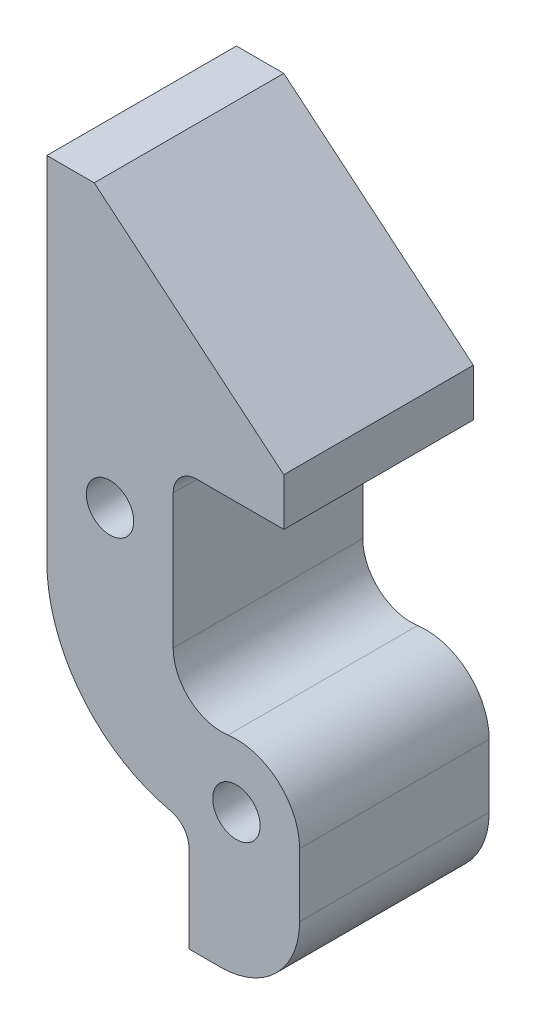
ISO-10303-21;
HEADER;
FILE_DESCRIPTION(('STEP AP214'),'2;1');
FILE_NAME('part.step','',(''),(''),'','','');
FILE_SCHEMA(('AUTOMOTIVE_DESIGN { 1 0 10303 214 1 1 1 1 }'));
ENDSEC;
DATA;
#1=APPLICATION_CONTEXT('core data for automotive mechanical design processes');
#2=APPLICATION_PROTOCOL_DEFINITION('international standard','automotive_design',2000,#1);
#3=PRODUCT_CONTEXT('',#1,'mechanical');
#4=PRODUCT('Part','Part','',(#3));
#5=PRODUCT_RELATED_PRODUCT_CATEGORY('part','',(#4));
#6=PRODUCT_DEFINITION_FORMATION('','',#4);
#7=PRODUCT_DEFINITION_CONTEXT('part definition',#1,'design');
#8=PRODUCT_DEFINITION('design','',#6,#7);
#9=PRODUCT_DEFINITION_SHAPE('','',#8);
#10=(LENGTH_UNIT() NAMED_UNIT(*) SI_UNIT(.MILLI.,.METRE.));
#11=(NAMED_UNIT(*) PLANE_ANGLE_UNIT() SI_UNIT($,.RADIAN.));
#12=(NAMED_UNIT(*) SI_UNIT($,.STERADIAN.) SOLID_ANGLE_UNIT());
#13=UNCERTAINTY_MEASURE_WITH_UNIT(LENGTH_MEASURE(1.E-05),#10,'distance_accuracy_value','');
#14=(GEOMETRIC_REPRESENTATION_CONTEXT(3) GLOBAL_UNCERTAINTY_ASSIGNED_CONTEXT((#13)) GLOBAL_UNIT_ASSIGNED_CONTEXT((#10,
#11,#12)) REPRESENTATION_CONTEXT('',''));
#15=CARTESIAN_POINT('',(0.,0.,0.));
#16=DIRECTION('',(0.,0.,1.));
#17=DIRECTION('',(1.,0.,0.));
#18=AXIS2_PLACEMENT_3D('',#15,#16,#17);
#19=CARTESIAN_POINT('',(-0.937500000000002,7.,12.));
#20=DIRECTION('',(0.,0.,1.));
#21=DIRECTION('',(1.,0.,0.));
#22=AXIS2_PLACEMENT_3D('',#19,#20,#21);
#23=PLANE('',#22);
#24=CARTESIAN_POINT('',(-4.5,-3.47318003282671,12.));
#25=DIRECTION('',(0.,0.,-1.));
#26=DIRECTION('',(-1.,0.,0.));
#27=AXIS2_PLACEMENT_3D('',#24,#25,#26);
#28=CIRCLE('',#27,1.5);
#29=CARTESIAN_POINT('',(-4.17391304347826,-2.00905322930647,12.));
#30=VERTEX_POINT('',#29);
#31=CARTESIAN_POINT('',(-3.00023737244657,-3.49986450385469,12.));
#32=VERTEX_POINT('',#31);
#33=EDGE_CURVE('E179',#30,#32,#28,.T.);
#34=ORIENTED_EDGE('',*,*,#33,.T.);
#35=CARTESIAN_POINT('',(6.99818014457627,-3.67776097737457,12.));
#36=DIRECTION('',(0.,0.,1.));
#37=DIRECTION('',(1.,0.,0.));
#38=AXIS2_PLACEMENT_3D('',#35,#36,#37);
#39=CIRCLE('',#38,10.);
#40=CARTESIAN_POINT('',(-3.,-3.86853255964208,12.));
#41=VERTEX_POINT('',#40);
#42=EDGE_CURVE('E13',#32,#41,#39,.T.);
#43=ORIENTED_EDGE('',*,*,#42,.T.);
#44=DIRECTION('',(0.,1.,0.));
#45=VECTOR('',#44,1.);
#46=CARTESIAN_POINT('',(-3.,-9.00000000000002,12.));
#47=LINE('',#46,#45);
#48=CARTESIAN_POINT('',(-3.,-9.00000000000002,12.));
#49=VERTEX_POINT('',#48);
#50=EDGE_CURVE('E184',#49,#41,#47,.T.);
#51=ORIENTED_EDGE('',*,*,#50,.F.);
#52=DIRECTION('',(-1.,0.,0.));
#53=VECTOR('',#52,1.);
#54=CARTESIAN_POINT('',(4.,-9.00000000000002,12.));
#55=LINE('',#54,#53);
#56=CARTESIAN_POINT('',(-0.999999999999999,-9.00000000000002,12.));
#57=VERTEX_POINT('',#56);
#58=EDGE_CURVE('E183',#57,#49,#55,.T.);
#59=ORIENTED_EDGE('',*,*,#58,.F.);
#60=CARTESIAN_POINT('',(-0.999999999999999,-4.00000000000002,12.));
#61=DIRECTION('',(0.,0.,1.));
#62=DIRECTION('',(1.,0.,0.));
#63=AXIS2_PLACEMENT_3D('',#60,#61,#62);
#64=CIRCLE('',#63,5.);
#65=CARTESIAN_POINT('',(4.,-4.00000000000002,12.));
#66=VERTEX_POINT('',#65);
#67=EDGE_CURVE('E280',#57,#66,#64,.T.);
#68=ORIENTED_EDGE('',*,*,#67,.T.);
#69=DIRECTION('',(0.,-1.,0.));
#70=VECTOR('',#69,1.);
#71=CARTESIAN_POINT('',(4.,0.,12.));
#72=LINE('',#71,#70);
#73=CARTESIAN_POINT('',(4.,0.,12.));
#74=VERTEX_POINT('',#73);
#75=EDGE_CURVE('E167',#74,#66,#72,.T.);
#76=ORIENTED_EDGE('',*,*,#75,.F.);
#77=CARTESIAN_POINT('',(0.,0.,12.));
#78=DIRECTION('',(0.,0.,1.));
#79=DIRECTION('',(1.,0.,0.));
#80=AXIS2_PLACEMENT_3D('',#77,#78,#79);
#81=CIRCLE('',#80,4.);
#82=CARTESIAN_POINT('',(-0.530973451327437,3.96460176991151,12.));
#83=VERTEX_POINT('',#82);
#84=EDGE_CURVE('E218',#74,#83,#81,.T.);
#85=ORIENTED_EDGE('',*,*,#84,.T.);
#86=CARTESIAN_POINT('',(-0.937500000000002,7.,12.));
#87=DIRECTION('',(0.,0.,-1.));
#88=DIRECTION('',(1.,0.,0.));
#89=AXIS2_PLACEMENT_3D('',#86,#87,#88);
#90=CIRCLE('',#89,3.0625);
#91=CARTESIAN_POINT('',(-4.,7.,12.));
#92=VERTEX_POINT('',#91);
#93=EDGE_CURVE('E220',#83,#92,#90,.T.);
#94=ORIENTED_EDGE('',*,*,#93,.T.);
#95=DIRECTION('',(0.,1.,0.));
#96=VECTOR('',#95,1.);
#97=CARTESIAN_POINT('',(-4.,7.,12.));
#98=LINE('',#97,#96);
#99=CARTESIAN_POINT('',(-4.,15.5,12.));
#100=VERTEX_POINT('',#99);
#101=EDGE_CURVE('E222',#92,#100,#98,.T.);
#102=ORIENTED_EDGE('',*,*,#101,.T.);
#103=CARTESIAN_POINT('',(-2.5,15.5,12.));
#104=DIRECTION('',(0.,0.,1.));
#105=DIRECTION('',(1.,0.,0.));
#106=AXIS2_PLACEMENT_3D('',#103,#104,#105);
#107=CIRCLE('',#106,1.5);
#108=CARTESIAN_POINT('',(-2.5,17.,12.));
#109=VERTEX_POINT('',#108);
#110=EDGE_CURVE('E271',#100,#109,#107,.F.);
#111=ORIENTED_EDGE('',*,*,#110,.T.);
#112=DIRECTION('',(1.,0.,0.));
#113=VECTOR('',#112,1.);
#114=CARTESIAN_POINT('',(-4.,17.,12.));
#115=LINE('',#114,#113);
#116=CARTESIAN_POINT('',(3.,17.,12.));
#117=VERTEX_POINT('',#116);
#118=EDGE_CURVE('E225',#109,#117,#115,.T.);
#119=ORIENTED_EDGE('',*,*,#118,.T.);
#120=DIRECTION('',(0.,1.,0.));
#121=VECTOR('',#120,1.);
#122=CARTESIAN_POINT('',(3.,17.,12.));
#123=LINE('',#122,#121);
#124=CARTESIAN_POINT('',(3.,20.,12.));
#125=VERTEX_POINT('',#124);
#126=EDGE_CURVE('E227',#117,#125,#123,.T.);
#127=ORIENTED_EDGE('',*,*,#126,.T.);
#128=DIRECTION('',(-0.768221279597376,0.64018439966448,0.));
#129=VECTOR('',#128,1.);
#130=CARTESIAN_POINT('',(3.,20.,12.));
#131=LINE('',#130,#129);
#132=CARTESIAN_POINT('',(-9.00000000000001,30.,12.));
#133=VERTEX_POINT('',#132);
#134=EDGE_CURVE('E209',#125,#133,#131,.T.);
#135=ORIENTED_EDGE('',*,*,#134,.T.);
#136=DIRECTION('',(-1.,0.,0.));
#137=VECTOR('',#136,1.);
#138=CARTESIAN_POINT('',(-9.00000000000001,30.,12.));
#139=LINE('',#138,#137);
#140=CARTESIAN_POINT('',(-12.,30.,12.));
#141=VERTEX_POINT('',#140);
#142=EDGE_CURVE('E212',#133,#141,#139,.T.);
#143=ORIENTED_EDGE('',*,*,#142,.T.);
#144=DIRECTION('',(0.,-1.,0.));
#145=VECTOR('',#144,1.);
#146=CARTESIAN_POINT('',(-12.,30.,12.));
#147=LINE('',#146,#145);
#148=CARTESIAN_POINT('',(-12.,7.75179212749512,12.));
#149=VERTEX_POINT('',#148);
#150=EDGE_CURVE('E215',#141,#149,#147,.T.);
#151=ORIENTED_EDGE('',*,*,#150,.T.);
#152=CARTESIAN_POINT('',(-2.,7.75179212749512,12.));
#153=DIRECTION('',(0.,0.,1.));
#154=DIRECTION('',(1.,0.,0.));
#155=AXIS2_PLACEMENT_3D('',#152,#153,#154);
#156=CIRCLE('',#155,10.);
#157=EDGE_CURVE('E285',#149,#30,#156,.T.);
#158=ORIENTED_EDGE('',*,*,#157,.T.);
#159=EDGE_LOOP('',(#34,#43,#51,#59,#68,#76,#85,#94,#102,#111,#119,#127,#135,#143,#151,#158));
#160=FACE_BOUND('',#159,.T.);
#161=CARTESIAN_POINT('',(0.,0.,12.));
#162=DIRECTION('',(0.,0.,1.));
#163=DIRECTION('',(1.,0.,0.));
#164=AXIS2_PLACEMENT_3D('',#161,#162,#163);
#165=CIRCLE('',#164,1.5);
#166=CARTESIAN_POINT('',(1.5,0.,12.));
#167=VERTEX_POINT('',#166);
#168=EDGE_CURVE('E203',#167,#167,#165,.T.);
#169=ORIENTED_EDGE('',*,*,#168,.F.);
#170=EDGE_LOOP('',(#169));
#171=FACE_BOUND('',#170,.T.);
#172=CARTESIAN_POINT('',(-8.,12.6885775404495,12.));
#173=DIRECTION('',(0.,0.,1.));
#174=DIRECTION('',(1.,0.,0.));
#175=AXIS2_PLACEMENT_3D('',#172,#173,#174);
#176=CIRCLE('',#175,1.5);
#177=CARTESIAN_POINT('',(-6.5,12.6885775404495,12.));
#178=VERTEX_POINT('',#177);
#179=EDGE_CURVE('E197',#178,#178,#176,.T.);
#180=ORIENTED_EDGE('',*,*,#179,.F.);
#181=EDGE_LOOP('',(#180));
#182=FACE_BOUND('',#181,.T.);
#183=ADVANCED_FACE('F46',(#160,#171,#182),#23,.T.);
#184=CARTESIAN_POINT('',(-0.937500000000002,7.,0.));
#185=DIRECTION('',(0.,0.,1.));
#186=DIRECTION('',(1.,0.,0.));
#187=AXIS2_PLACEMENT_3D('',#184,#185,#186);
#188=PLANE('',#187);
#189=DIRECTION('',(0.,-1.,0.));
#190=VECTOR('',#189,1.);
#191=CARTESIAN_POINT('',(-3.,-9.00000000000002,0.));
#192=LINE('',#191,#190);
#193=CARTESIAN_POINT('',(-3.,-3.86853255964208,0.));
#194=VERTEX_POINT('',#193);
#195=CARTESIAN_POINT('',(-3.,-9.00000000000002,0.));
#196=VERTEX_POINT('',#195);
#197=EDGE_CURVE('E161',#194,#196,#192,.T.);
#198=ORIENTED_EDGE('',*,*,#197,.F.);
#199=CARTESIAN_POINT('',(6.99818014457627,-3.67776097737457,0.));
#200=DIRECTION('',(0.,0.,1.));
#201=DIRECTION('',(1.,0.,0.));
#202=AXIS2_PLACEMENT_3D('',#199,#200,#201);
#203=CIRCLE('',#202,10.);
#204=CARTESIAN_POINT('',(-3.00023737244657,-3.49986450385469,0.));
#205=VERTEX_POINT('',#204);
#206=EDGE_CURVE('E68',#194,#205,#203,.F.);
#207=ORIENTED_EDGE('',*,*,#206,.T.);
#208=CARTESIAN_POINT('',(-4.5,-3.47318003282671,0.));
#209=DIRECTION('',(0.,0.,-1.));
#210=DIRECTION('',(-1.,0.,0.));
#211=AXIS2_PLACEMENT_3D('',#208,#209,#210);
#212=CIRCLE('',#211,1.5);
#213=CARTESIAN_POINT('',(-4.17391304347826,-2.00905322930647,0.));
#214=VERTEX_POINT('',#213);
#215=EDGE_CURVE('E293',#214,#205,#212,.T.);
#216=ORIENTED_EDGE('',*,*,#215,.F.);
#217=CARTESIAN_POINT('',(-2.,7.75179212749512,0.));
#218=DIRECTION('',(0.,0.,1.));
#219=DIRECTION('',(1.,0.,0.));
#220=AXIS2_PLACEMENT_3D('',#217,#218,#219);
#221=CIRCLE('',#220,10.);
#222=CARTESIAN_POINT('',(-12.,7.75179212749512,0.));
#223=VERTEX_POINT('',#222);
#224=EDGE_CURVE('E289',#214,#223,#221,.F.);
#225=ORIENTED_EDGE('',*,*,#224,.T.);
#226=DIRECTION('',(0.,-1.,0.));
#227=VECTOR('',#226,1.);
#228=CARTESIAN_POINT('',(-12.,30.,0.));
#229=LINE('',#228,#227);
#230=CARTESIAN_POINT('',(-12.,30.,0.));
#231=VERTEX_POINT('',#230);
#232=EDGE_CURVE('E234',#231,#223,#229,.T.);
#233=ORIENTED_EDGE('',*,*,#232,.F.);
#234=DIRECTION('',(-1.,0.,0.));
#235=VECTOR('',#234,1.);
#236=CARTESIAN_POINT('',(-9.00000000000001,30.,0.));
#237=LINE('',#236,#235);
#238=CARTESIAN_POINT('',(-9.00000000000001,30.,0.));
#239=VERTEX_POINT('',#238);
#240=EDGE_CURVE('E232',#239,#231,#237,.T.);
#241=ORIENTED_EDGE('',*,*,#240,.F.);
#242=DIRECTION('',(-0.768221279597376,0.64018439966448,0.));
#243=VECTOR('',#242,1.);
#244=CARTESIAN_POINT('',(3.,20.,0.));
#245=LINE('',#244,#243);
#246=CARTESIAN_POINT('',(3.,20.,0.));
#247=VERTEX_POINT('',#246);
#248=EDGE_CURVE('E206',#247,#239,#245,.T.);
#249=ORIENTED_EDGE('',*,*,#248,.F.);
#250=DIRECTION('',(0.,1.,0.));
#251=VECTOR('',#250,1.);
#252=CARTESIAN_POINT('',(3.,17.,0.));
#253=LINE('',#252,#251);
#254=CARTESIAN_POINT('',(3.,17.,0.));
#255=VERTEX_POINT('',#254);
#256=EDGE_CURVE('E213',#255,#247,#253,.T.);
#257=ORIENTED_EDGE('',*,*,#256,.F.);
#258=DIRECTION('',(1.,0.,0.));
#259=VECTOR('',#258,1.);
#260=CARTESIAN_POINT('',(-4.,17.,0.));
#261=LINE('',#260,#259);
#262=CARTESIAN_POINT('',(-2.5,17.,0.));
#263=VERTEX_POINT('',#262);
#264=EDGE_CURVE('E244',#263,#255,#261,.T.);
#265=ORIENTED_EDGE('',*,*,#264,.F.);
#266=CARTESIAN_POINT('',(-2.5,15.5,0.));
#267=DIRECTION('',(0.,0.,1.));
#268=DIRECTION('',(1.,0.,0.));
#269=AXIS2_PLACEMENT_3D('',#266,#267,#268);
#270=CIRCLE('',#269,1.5);
#271=CARTESIAN_POINT('',(-4.,15.5,0.));
#272=VERTEX_POINT('',#271);
#273=EDGE_CURVE('E269',#263,#272,#270,.T.);
#274=ORIENTED_EDGE('',*,*,#273,.T.);
#275=DIRECTION('',(0.,1.,0.));
#276=VECTOR('',#275,1.);
#277=CARTESIAN_POINT('',(-4.,7.,0.));
#278=LINE('',#277,#276);
#279=CARTESIAN_POINT('',(-4.,7.,0.));
#280=VERTEX_POINT('',#279);
#281=EDGE_CURVE('E241',#280,#272,#278,.T.);
#282=ORIENTED_EDGE('',*,*,#281,.F.);
#283=CARTESIAN_POINT('',(-0.937500000000002,7.,0.));
#284=DIRECTION('',(0.,0.,-1.));
#285=DIRECTION('',(1.,0.,0.));
#286=AXIS2_PLACEMENT_3D('',#283,#284,#285);
#287=CIRCLE('',#286,3.0625);
#288=CARTESIAN_POINT('',(-0.530973451327437,3.96460176991151,0.));
#289=VERTEX_POINT('',#288);
#290=EDGE_CURVE('E239',#289,#280,#287,.T.);
#291=ORIENTED_EDGE('',*,*,#290,.F.);
#292=CARTESIAN_POINT('',(0.,0.,0.));
#293=DIRECTION('',(0.,0.,1.));
#294=DIRECTION('',(1.,0.,0.));
#295=AXIS2_PLACEMENT_3D('',#292,#293,#294);
#296=CIRCLE('',#295,4.);
#297=CARTESIAN_POINT('',(4.,0.,0.));
#298=VERTEX_POINT('',#297);
#299=EDGE_CURVE('E237',#298,#289,#296,.T.);
#300=ORIENTED_EDGE('',*,*,#299,.F.);
#301=DIRECTION('',(0.,-1.,0.));
#302=VECTOR('',#301,1.);
#303=CARTESIAN_POINT('',(4.,0.,0.));
#304=LINE('',#303,#302);
#305=CARTESIAN_POINT('',(4.,-4.00000000000002,0.));
#306=VERTEX_POINT('',#305);
#307=EDGE_CURVE('E168',#298,#306,#304,.T.);
#308=ORIENTED_EDGE('',*,*,#307,.T.);
#309=CARTESIAN_POINT('',(-0.999999999999999,-4.00000000000002,0.));
#310=DIRECTION('',(0.,0.,1.));
#311=DIRECTION('',(1.,0.,0.));
#312=AXIS2_PLACEMENT_3D('',#309,#310,#311);
#313=CIRCLE('',#312,5.);
#314=CARTESIAN_POINT('',(-0.999999999999999,-9.00000000000002,0.));
#315=VERTEX_POINT('',#314);
#316=EDGE_CURVE('E163',#306,#315,#313,.F.);
#317=ORIENTED_EDGE('',*,*,#316,.T.);
#318=DIRECTION('',(-1.,0.,0.));
#319=VECTOR('',#318,1.);
#320=CARTESIAN_POINT('',(4.,-9.00000000000002,0.));
#321=LINE('',#320,#319);
#322=EDGE_CURVE('E157',#315,#196,#321,.T.);
#323=ORIENTED_EDGE('',*,*,#322,.T.);
#324=EDGE_LOOP('',(#198,#207,#216,#225,#233,#241,#249,#257,#265,#274,#282,#291,#300,#308,#317,#323));
#325=FACE_BOUND('',#324,.T.);
#326=CARTESIAN_POINT('',(-8.,12.6885775404495,0.));
#327=DIRECTION('',(0.,0.,1.));
#328=DIRECTION('',(1.,0.,0.));
#329=AXIS2_PLACEMENT_3D('',#326,#327,#328);
#330=CIRCLE('',#329,1.5);
#331=CARTESIAN_POINT('',(-6.5,12.6885775404495,0.));
#332=VERTEX_POINT('',#331);
#333=EDGE_CURVE('E196',#332,#332,#330,.T.);
#334=ORIENTED_EDGE('',*,*,#333,.T.);
#335=EDGE_LOOP('',(#334));
#336=FACE_BOUND('',#335,.T.);
#337=CARTESIAN_POINT('',(0.,0.,0.));
#338=DIRECTION('',(0.,0.,1.));
#339=DIRECTION('',(1.,0.,0.));
#340=AXIS2_PLACEMENT_3D('',#337,#338,#339);
#341=CIRCLE('',#340,1.5);
#342=CARTESIAN_POINT('',(1.5,0.,0.));
#343=VERTEX_POINT('',#342);
#344=EDGE_CURVE('E200',#343,#343,#341,.T.);
#345=ORIENTED_EDGE('',*,*,#344,.T.);
#346=EDGE_LOOP('',(#345));
#347=FACE_BOUND('',#346,.T.);
#348=ADVANCED_FACE('F159',(#325,#336,#347),#188,.F.);
#349=CARTESIAN_POINT('',(3.,20.,12.));
#350=DIRECTION('',(-0.64018439966448,-0.768221279597376,0.));
#351=DIRECTION('',(0.768221279597376,-0.64018439966448,0.));
#352=AXIS2_PLACEMENT_3D('',#349,#350,#351);
#353=PLANE('',#352);
#354=ORIENTED_EDGE('',*,*,#248,.T.);
#355=DIRECTION('',(0.,0.,-1.));
#356=VECTOR('',#355,1.);
#357=CARTESIAN_POINT('',(-9.00000000000001,30.,12.));
#358=LINE('',#357,#356);
#359=EDGE_CURVE('E261',#133,#239,#358,.T.);
#360=ORIENTED_EDGE('',*,*,#359,.F.);
#361=ORIENTED_EDGE('',*,*,#134,.F.);
#362=DIRECTION('',(0.,0.,-1.));
#363=VECTOR('',#362,1.);
#364=CARTESIAN_POINT('',(3.,20.,12.));
#365=LINE('',#364,#363);
#366=EDGE_CURVE('E229',#125,#247,#365,.T.);
#367=ORIENTED_EDGE('',*,*,#366,.T.);
#368=EDGE_LOOP('',(#354,#360,#361,#367));
#369=FACE_BOUND('',#368,.T.);
#370=ADVANCED_FACE('F346',(#369),#353,.F.);
#371=CARTESIAN_POINT('',(-9.00000000000001,30.,12.));
#372=DIRECTION('',(0.,-1.,0.));
#373=DIRECTION('',(0.,0.,-1.));
#374=AXIS2_PLACEMENT_3D('',#371,#372,#373);
#375=PLANE('',#374);
#376=ORIENTED_EDGE('',*,*,#240,.T.);
#377=DIRECTION('',(0.,0.,-1.));
#378=VECTOR('',#377,1.);
#379=CARTESIAN_POINT('',(-12.,30.,12.));
#380=LINE('',#379,#378);
#381=EDGE_CURVE('E258',#141,#231,#380,.T.);
#382=ORIENTED_EDGE('',*,*,#381,.F.);
#383=ORIENTED_EDGE('',*,*,#142,.F.);
#384=ORIENTED_EDGE('',*,*,#359,.T.);
#385=EDGE_LOOP('',(#376,#382,#383,#384));
#386=FACE_BOUND('',#385,.T.);
#387=ADVANCED_FACE('F349',(#386),#375,.F.);
#388=CARTESIAN_POINT('',(-12.,30.,12.));
#389=DIRECTION('',(1.,0.,0.));
#390=DIRECTION('',(0.,1.,0.));
#391=AXIS2_PLACEMENT_3D('',#388,#389,#390);
#392=PLANE('',#391);
#393=ORIENTED_EDGE('',*,*,#232,.T.);
#394=DIRECTION('',(0.,0.,-1.));
#395=VECTOR('',#394,1.);
#396=CARTESIAN_POINT('',(-12.,7.75179212749512,12.));
#397=LINE('',#396,#395);
#398=EDGE_CURVE('E282',#223,#149,#397,.F.);
#399=ORIENTED_EDGE('',*,*,#398,.T.);
#400=ORIENTED_EDGE('',*,*,#150,.F.);
#401=ORIENTED_EDGE('',*,*,#381,.T.);
#402=EDGE_LOOP('',(#393,#399,#400,#401));
#403=FACE_BOUND('',#402,.T.);
#404=ADVANCED_FACE('F298',(#403),#392,.F.);
#405=CARTESIAN_POINT('',(0.,0.,12.));
#406=DIRECTION('',(0.,0.,-1.));
#407=DIRECTION('',(-1.,0.,0.));
#408=AXIS2_PLACEMENT_3D('',#405,#406,#407);
#409=CYLINDRICAL_SURFACE('',#408,4.);
#410=ORIENTED_EDGE('',*,*,#84,.F.);
#411=DIRECTION('',(0.,0.,-1.));
#412=VECTOR('',#411,1.);
#413=CARTESIAN_POINT('',(4.,0.,21.8488578017961));
#414=LINE('',#413,#412);
#415=EDGE_CURVE('E193',#74,#298,#414,.T.);
#416=ORIENTED_EDGE('',*,*,#415,.T.);
#417=ORIENTED_EDGE('',*,*,#299,.T.);
#418=DIRECTION('',(0.,0.,-1.));
#419=VECTOR('',#418,1.);
#420=CARTESIAN_POINT('',(-0.530973451327437,3.96460176991151,12.));
#421=LINE('',#420,#419);
#422=EDGE_CURVE('E255',#83,#289,#421,.T.);
#423=ORIENTED_EDGE('',*,*,#422,.F.);
#424=EDGE_LOOP('',(#410,#416,#417,#423));
#425=FACE_BOUND('',#424,.T.);
#426=ADVANCED_FACE('F321',(#425),#409,.T.);
#427=CARTESIAN_POINT('',(-0.937500000000002,7.,12.));
#428=DIRECTION('',(0.,0.,-1.));
#429=DIRECTION('',(-1.,0.,0.));
#430=AXIS2_PLACEMENT_3D('',#427,#428,#429);
#431=CYLINDRICAL_SURFACE('',#430,3.0625);
#432=ORIENTED_EDGE('',*,*,#290,.T.);
#433=DIRECTION('',(0.,0.,-1.));
#434=VECTOR('',#433,1.);
#435=CARTESIAN_POINT('',(-4.,7.,12.));
#436=LINE('',#435,#434);
#437=EDGE_CURVE('E252',#92,#280,#436,.T.);
#438=ORIENTED_EDGE('',*,*,#437,.F.);
#439=ORIENTED_EDGE('',*,*,#93,.F.);
#440=ORIENTED_EDGE('',*,*,#422,.T.);
#441=EDGE_LOOP('',(#432,#438,#439,#440));
#442=FACE_BOUND('',#441,.T.);
#443=ADVANCED_FACE('F324',(#442),#431,.F.);
#444=CARTESIAN_POINT('',(-4.,7.,12.));
#445=DIRECTION('',(-1.,0.,0.));
#446=DIRECTION('',(0.,0.,1.));
#447=AXIS2_PLACEMENT_3D('',#444,#445,#446);
#448=PLANE('',#447);
#449=ORIENTED_EDGE('',*,*,#281,.T.);
#450=DIRECTION('',(0.,0.,-1.));
#451=VECTOR('',#450,1.);
#452=CARTESIAN_POINT('',(-4.,15.5,12.));
#453=LINE('',#452,#451);
#454=EDGE_CURVE('E267',#272,#100,#453,.F.);
#455=ORIENTED_EDGE('',*,*,#454,.T.);
#456=ORIENTED_EDGE('',*,*,#101,.F.);
#457=ORIENTED_EDGE('',*,*,#437,.T.);
#458=EDGE_LOOP('',(#449,#455,#456,#457));
#459=FACE_BOUND('',#458,.T.);
#460=ADVANCED_FACE('F372',(#459),#448,.F.);
#461=CARTESIAN_POINT('',(-4.,17.,12.));
#462=DIRECTION('',(0.,1.,0.));
#463=DIRECTION('',(0.,0.,1.));
#464=AXIS2_PLACEMENT_3D('',#461,#462,#463);
#465=PLANE('',#464);
#466=ORIENTED_EDGE('',*,*,#118,.F.);
#467=DIRECTION('',(0.,0.,-1.));
#468=VECTOR('',#467,1.);
#469=CARTESIAN_POINT('',(-2.5,17.,0.));
#470=LINE('',#469,#468);
#471=EDGE_CURVE('E264',#109,#263,#470,.T.);
#472=ORIENTED_EDGE('',*,*,#471,.T.);
#473=ORIENTED_EDGE('',*,*,#264,.T.);
#474=DIRECTION('',(0.,0.,-1.));
#475=VECTOR('',#474,1.);
#476=CARTESIAN_POINT('',(3.,17.,12.));
#477=LINE('',#476,#475);
#478=EDGE_CURVE('E249',#117,#255,#477,.T.);
#479=ORIENTED_EDGE('',*,*,#478,.F.);
#480=EDGE_LOOP('',(#466,#472,#473,#479));
#481=FACE_BOUND('',#480,.T.);
#482=ADVANCED_FACE('F336',(#481),#465,.F.);
#483=CARTESIAN_POINT('',(3.,17.,12.));
#484=DIRECTION('',(-1.,0.,0.));
#485=DIRECTION('',(0.,0.,1.));
#486=AXIS2_PLACEMENT_3D('',#483,#484,#485);
#487=PLANE('',#486);
#488=ORIENTED_EDGE('',*,*,#256,.T.);
#489=ORIENTED_EDGE('',*,*,#366,.F.);
#490=ORIENTED_EDGE('',*,*,#126,.F.);
#491=ORIENTED_EDGE('',*,*,#478,.T.);
#492=EDGE_LOOP('',(#488,#489,#490,#491));
#493=FACE_BOUND('',#492,.T.);
#494=ADVANCED_FACE('F342',(#493),#487,.F.);
#495=CARTESIAN_POINT('',(0.,0.,12.));
#496=DIRECTION('',(0.,0.,-1.));
#497=DIRECTION('',(-1.,0.,0.));
#498=AXIS2_PLACEMENT_3D('',#495,#496,#497);
#499=CYLINDRICAL_SURFACE('',#498,1.5);
#500=ORIENTED_EDGE('',*,*,#168,.T.);
#501=EDGE_LOOP('',(#500));
#502=FACE_BOUND('',#501,.T.);
#503=ORIENTED_EDGE('',*,*,#344,.F.);
#504=EDGE_LOOP('',(#503));
#505=FACE_BOUND('',#504,.T.);
#506=ADVANCED_FACE('F365',(#502,#505),#499,.F.);
#507=CARTESIAN_POINT('',(-8.,12.6885775404495,12.));
#508=DIRECTION('',(0.,0.,-1.));
#509=DIRECTION('',(-1.,0.,0.));
#510=AXIS2_PLACEMENT_3D('',#507,#508,#509);
#511=CYLINDRICAL_SURFACE('',#510,1.5);
#512=ORIENTED_EDGE('',*,*,#179,.T.);
#513=EDGE_LOOP('',(#512));
#514=FACE_BOUND('',#513,.T.);
#515=ORIENTED_EDGE('',*,*,#333,.F.);
#516=EDGE_LOOP('',(#515));
#517=FACE_BOUND('',#516,.T.);
#518=ADVANCED_FACE('F407',(#514,#517),#511,.F.);
#519=CARTESIAN_POINT('',(-2.5,15.5,12.));
#520=DIRECTION('',(0.,0.,1.));
#521=DIRECTION('',(1.,0.,0.));
#522=AXIS2_PLACEMENT_3D('',#519,#520,#521);
#523=CYLINDRICAL_SURFACE('',#522,1.5);
#524=ORIENTED_EDGE('',*,*,#110,.F.);
#525=ORIENTED_EDGE('',*,*,#454,.F.);
#526=ORIENTED_EDGE('',*,*,#273,.F.);
#527=ORIENTED_EDGE('',*,*,#471,.F.);
#528=EDGE_LOOP('',(#524,#525,#526,#527));
#529=FACE_BOUND('',#528,.T.);
#530=ADVANCED_FACE('F333',(#529),#523,.F.);
#531=CARTESIAN_POINT('',(4.,0.,21.8488578017961));
#532=DIRECTION('',(1.,0.,0.));
#533=DIRECTION('',(0.,0.,-1.));
#534=AXIS2_PLACEMENT_3D('',#531,#532,#533);
#535=PLANE('',#534);
#536=ORIENTED_EDGE('',*,*,#75,.T.);
#537=DIRECTION('',(0.,0.,-1.));
#538=VECTOR('',#537,1.);
#539=CARTESIAN_POINT('',(4.,-4.00000000000002,21.8488578017961));
#540=LINE('',#539,#538);
#541=EDGE_CURVE('E274',#66,#306,#540,.T.);
#542=ORIENTED_EDGE('',*,*,#541,.T.);
#543=ORIENTED_EDGE('',*,*,#307,.F.);
#544=ORIENTED_EDGE('',*,*,#415,.F.);
#545=EDGE_LOOP('',(#536,#542,#543,#544));
#546=FACE_BOUND('',#545,.T.);
#547=ADVANCED_FACE('F313',(#546),#535,.T.);
#548=CARTESIAN_POINT('',(4.,-9.00000000000002,21.8488578017961));
#549=DIRECTION('',(0.,-1.,0.));
#550=DIRECTION('',(0.,0.,-1.));
#551=AXIS2_PLACEMENT_3D('',#548,#549,#550);
#552=PLANE('',#551);
#553=ORIENTED_EDGE('',*,*,#322,.F.);
#554=DIRECTION('',(0.,0.,-1.));
#555=VECTOR('',#554,1.);
#556=CARTESIAN_POINT('',(-0.999999999999999,-9.00000000000002,21.8488578017961));
#557=LINE('',#556,#555);
#558=EDGE_CURVE('E278',#315,#57,#557,.F.);
#559=ORIENTED_EDGE('',*,*,#558,.T.);
#560=ORIENTED_EDGE('',*,*,#58,.T.);
#561=DIRECTION('',(0.,0.,1.));
#562=VECTOR('',#561,1.);
#563=CARTESIAN_POINT('',(-3.,-9.00000000000002,0.));
#564=LINE('',#563,#562);
#565=EDGE_CURVE('E175',#196,#49,#564,.T.);
#566=ORIENTED_EDGE('',*,*,#565,.F.);
#567=EDGE_LOOP('',(#553,#559,#560,#566));
#568=FACE_BOUND('',#567,.T.);
#569=ADVANCED_FACE('F181',(#568),#552,.T.);
#570=CARTESIAN_POINT('',(-3.,0.,0.));
#571=DIRECTION('',(1.,0.,0.));
#572=DIRECTION('',(0.,0.,-1.));
#573=AXIS2_PLACEMENT_3D('',#570,#571,#572);
#574=PLANE('',#573);
#575=ORIENTED_EDGE('',*,*,#50,.T.);
#576=DIRECTION('',(0.,0.,-1.));
#577=VECTOR('',#576,1.);
#578=CARTESIAN_POINT('',(-3.,-3.86853255964208,12.));
#579=LINE('',#578,#577);
#580=EDGE_CURVE('E178',#41,#194,#579,.T.);
#581=ORIENTED_EDGE('',*,*,#580,.T.);
#582=ORIENTED_EDGE('',*,*,#197,.T.);
#583=ORIENTED_EDGE('',*,*,#565,.T.);
#584=EDGE_LOOP('',(#575,#581,#582,#583));
#585=FACE_BOUND('',#584,.T.);
#586=ADVANCED_FACE('F174',(#585),#574,.F.);
#587=CARTESIAN_POINT('',(-0.999999999999999,-4.00000000000002,21.8488578017961));
#588=DIRECTION('',(0.,0.,-1.));
#589=DIRECTION('',(-1.,0.,0.));
#590=AXIS2_PLACEMENT_3D('',#587,#588,#589);
#591=CYLINDRICAL_SURFACE('',#590,5.);
#592=ORIENTED_EDGE('',*,*,#67,.F.);
#593=ORIENTED_EDGE('',*,*,#558,.F.);
#594=ORIENTED_EDGE('',*,*,#316,.F.);
#595=ORIENTED_EDGE('',*,*,#541,.F.);
#596=EDGE_LOOP('',(#592,#593,#594,#595));
#597=FACE_BOUND('',#596,.T.);
#598=ADVANCED_FACE('F311',(#597),#591,.T.);
#599=CARTESIAN_POINT('',(-4.5,-3.47318003282671,12.));
#600=DIRECTION('',(0.,0.,-1.));
#601=DIRECTION('',(-1.,0.,0.));
#602=AXIS2_PLACEMENT_3D('',#599,#600,#601);
#603=CYLINDRICAL_SURFACE('',#602,1.5);
#604=ORIENTED_EDGE('',*,*,#215,.T.);
#605=DIRECTION('',(0.,0.,-1.));
#606=VECTOR('',#605,1.);
#607=CARTESIAN_POINT('',(-3.00023737244657,-3.49986450385469,12.));
#608=LINE('',#607,#606);
#609=EDGE_CURVE('E54',#205,#32,#608,.F.);
#610=ORIENTED_EDGE('',*,*,#609,.T.);
#611=ORIENTED_EDGE('',*,*,#33,.F.);
#612=DIRECTION('',(0.,0.,-1.));
#613=VECTOR('',#612,1.);
#614=CARTESIAN_POINT('',(-4.17391304347826,-2.00905322930647,12.));
#615=LINE('',#614,#613);
#616=EDGE_CURVE('E287',#30,#214,#615,.T.);
#617=ORIENTED_EDGE('',*,*,#616,.T.);
#618=EDGE_LOOP('',(#604,#610,#611,#617));
#619=FACE_BOUND('',#618,.T.);
#620=ADVANCED_FACE('F305',(#619),#603,.F.);
#621=CARTESIAN_POINT('',(-2.,7.75179212749512,12.));
#622=DIRECTION('',(0.,0.,-1.));
#623=DIRECTION('',(-1.,0.,0.));
#624=AXIS2_PLACEMENT_3D('',#621,#622,#623);
#625=CYLINDRICAL_SURFACE('',#624,10.);
#626=ORIENTED_EDGE('',*,*,#224,.F.);
#627=ORIENTED_EDGE('',*,*,#616,.F.);
#628=ORIENTED_EDGE('',*,*,#157,.F.);
#629=ORIENTED_EDGE('',*,*,#398,.F.);
#630=EDGE_LOOP('',(#626,#627,#628,#629));
#631=FACE_BOUND('',#630,.T.);
#632=ADVANCED_FACE('F301',(#631),#625,.T.);
#633=CARTESIAN_POINT('',(6.99818014457627,-3.67776097737457,12.));
#634=DIRECTION('',(0.,0.,-1.));
#635=DIRECTION('',(-1.,0.,0.));
#636=AXIS2_PLACEMENT_3D('',#633,#634,#635);
#637=CYLINDRICAL_SURFACE('',#636,10.);
#638=ORIENTED_EDGE('',*,*,#42,.F.);
#639=ORIENTED_EDGE('',*,*,#609,.F.);
#640=ORIENTED_EDGE('',*,*,#206,.F.);
#641=ORIENTED_EDGE('',*,*,#580,.F.);
#642=EDGE_LOOP('',(#638,#639,#640,#641));
#643=FACE_BOUND('',#642,.T.);
#644=ADVANCED_FACE('F48',(#643),#637,.T.);
#645=CLOSED_SHELL('',(#183,#348,#370,#387,#404,#426,#443,#460,#482,#494,#506,#518,#530,#547,
#569,#586,#598,#620,#632,#644));
#646=MANIFOLD_SOLID_BREP('B2',#645);
#647=ADVANCED_BREP_SHAPE_REPRESENTATION('',(#18,#646),#14);
#648=SHAPE_DEFINITION_REPRESENTATION(#9,#647);
ENDSEC;
END-ISO-10303-21;
